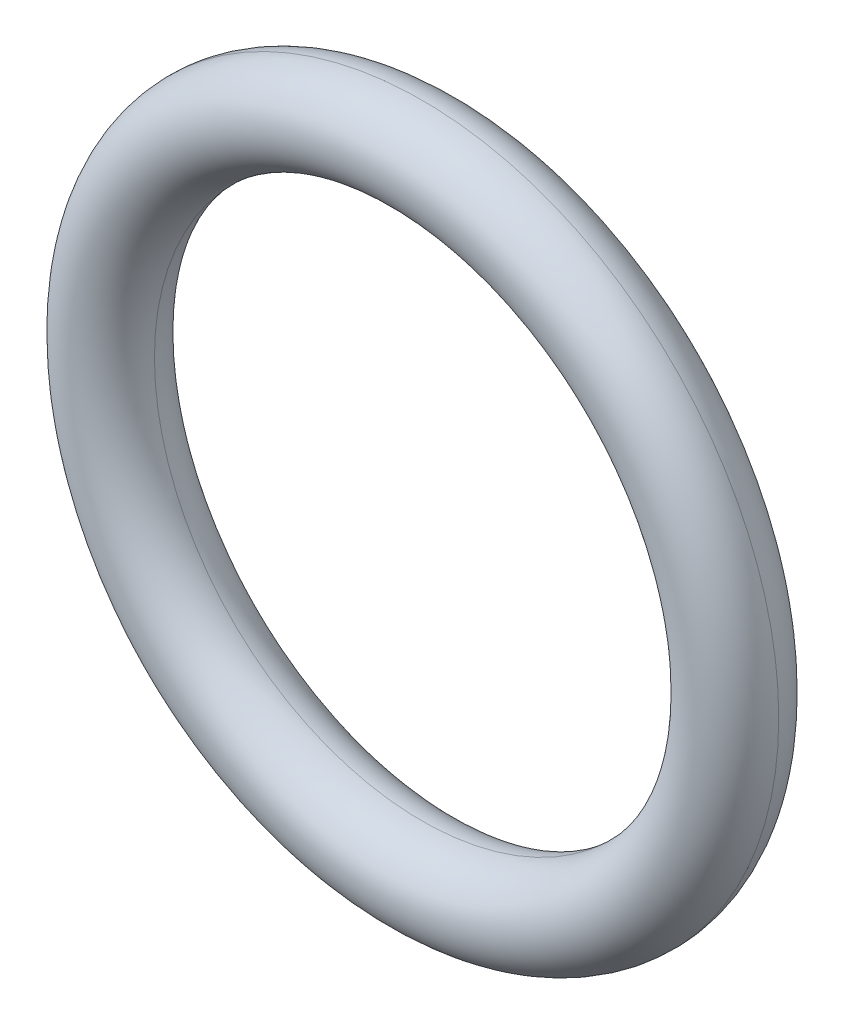
ISO-10303-21;
HEADER;
FILE_DESCRIPTION(('STEP AP214'),'2;1');
FILE_NAME('part.step','',(''),(''),'','','');
FILE_SCHEMA(('AUTOMOTIVE_DESIGN { 1 0 10303 214 1 1 1 1 }'));
ENDSEC;
DATA;
#1=APPLICATION_CONTEXT('core data for automotive mechanical design processes');
#2=APPLICATION_PROTOCOL_DEFINITION('international standard','automotive_design',2000,#1);
#3=PRODUCT_CONTEXT('',#1,'mechanical');
#4=PRODUCT('Part','Part','',(#3));
#5=PRODUCT_RELATED_PRODUCT_CATEGORY('part','',(#4));
#6=PRODUCT_DEFINITION_FORMATION('','',#4);
#7=PRODUCT_DEFINITION_CONTEXT('part definition',#1,'design');
#8=PRODUCT_DEFINITION('design','',#6,#7);
#9=PRODUCT_DEFINITION_SHAPE('','',#8);
#10=(LENGTH_UNIT() NAMED_UNIT(*) SI_UNIT(.MILLI.,.METRE.));
#11=(NAMED_UNIT(*) PLANE_ANGLE_UNIT() SI_UNIT($,.RADIAN.));
#12=(NAMED_UNIT(*) SI_UNIT($,.STERADIAN.) SOLID_ANGLE_UNIT());
#13=UNCERTAINTY_MEASURE_WITH_UNIT(LENGTH_MEASURE(1.E-05),#10,'distance_accuracy_value','');
#14=(GEOMETRIC_REPRESENTATION_CONTEXT(3) GLOBAL_UNCERTAINTY_ASSIGNED_CONTEXT((#13)) GLOBAL_UNIT_ASSIGNED_CONTEXT((#10,
#11,#12)) REPRESENTATION_CONTEXT('',''));
#15=CARTESIAN_POINT('',(0.,0.,0.));
#16=DIRECTION('',(0.,0.,1.));
#17=DIRECTION('',(1.,0.,0.));
#18=AXIS2_PLACEMENT_3D('',#15,#16,#17);
#19=CARTESIAN_POINT('',(0.,0.,0.999998461076685));
#20=DIRECTION('',(0.,0.,-1.));
#21=DIRECTION('',(-1.,0.,0.));
#22=AXIS2_PLACEMENT_3D('',#19,#20,#21);
#23=TOROIDAL_SURFACE('',#22,3.49999999999882,0.5);
#24=CARTESIAN_POINT('',(0.,0.,0.999998461076685));
#25=DIRECTION('',(0.,0.,-1.));
#26=DIRECTION('',(-1.,0.,0.));
#27=AXIS2_PLACEMENT_3D('',#24,#25,#26);
#28=CIRCLE('',#27,3.);
#29=CARTESIAN_POINT('',(-3.,0.,0.999998461076685));
#30=VERTEX_POINT('',#29);
#31=EDGE_CURVE('E40',#30,#30,#28,.T.);
#32=ORIENTED_EDGE('',*,*,#31,.F.);
#33=EDGE_LOOP('',(#32));
#34=FACE_BOUND('',#33,.T.);
#35=CARTESIAN_POINT('',(0.,0.,0.999996922153371));
#36=DIRECTION('',(0.,0.,1.));
#37=DIRECTION('',(1.,0.,0.));
#38=AXIS2_PLACEMENT_3D('',#35,#36,#37);
#39=CIRCLE('',#38,3.99999999999526);
#40=CARTESIAN_POINT('',(3.99999999999526,0.,0.999996922153371));
#41=VERTEX_POINT('',#40);
#42=EDGE_CURVE('E10',#41,#41,#39,.T.);
#43=ORIENTED_EDGE('',*,*,#42,.F.);
#44=EDGE_LOOP('',(#43));
#45=FACE_BOUND('',#44,.T.);
#46=ADVANCED_FACE('F34',(#34,#45),#23,.T.);
#47=CARTESIAN_POINT('',(0.,0.,1.00000153892331));
#48=DIRECTION('',(0.,0.,-1.));
#49=DIRECTION('',(-1.,0.,0.));
#50=AXIS2_PLACEMENT_3D('',#47,#48,#49);
#51=TOROIDAL_SURFACE('',#50,3.49999999999882,0.5);
#52=ORIENTED_EDGE('',*,*,#42,.T.);
#53=EDGE_LOOP('',(#52));
#54=FACE_BOUND('',#53,.T.);
#55=ORIENTED_EDGE('',*,*,#31,.T.);
#56=EDGE_LOOP('',(#55));
#57=FACE_BOUND('',#56,.T.);
#58=ADVANCED_FACE('F46',(#54,#57),#51,.T.);
#59=CLOSED_SHELL('',(#46,#58));
#60=MANIFOLD_SOLID_BREP('B2',#59);
#61=ADVANCED_BREP_SHAPE_REPRESENTATION('',(#18,#60),#14);
#62=SHAPE_DEFINITION_REPRESENTATION(#9,#61);
ENDSEC;
END-ISO-10303-21;
